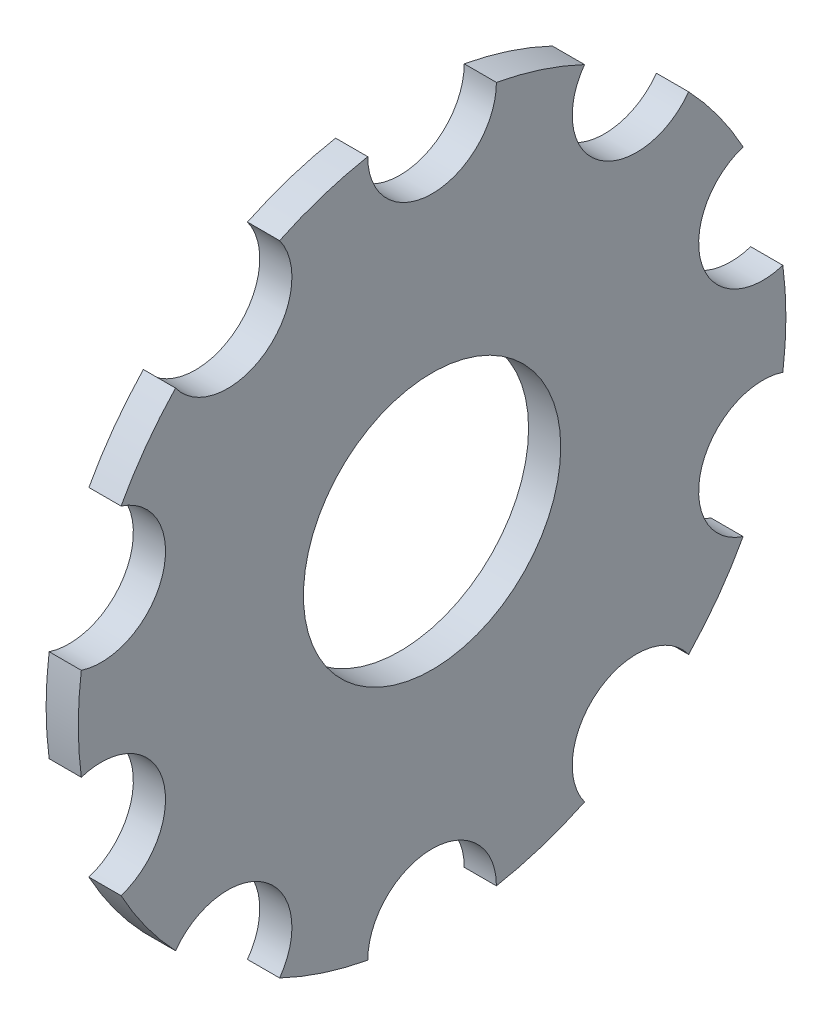
ISO-10303-21;
HEADER;
FILE_DESCRIPTION(('STEP AP214'),'2;1');
FILE_NAME('part.step','',(''),(''),'','','');
FILE_SCHEMA(('AUTOMOTIVE_DESIGN { 1 0 10303 214 1 1 1 1 }'));
ENDSEC;
DATA;
#1=APPLICATION_CONTEXT('core data for automotive mechanical design processes');
#2=APPLICATION_PROTOCOL_DEFINITION('international standard','automotive_design',2000,#1);
#3=PRODUCT_CONTEXT('',#1,'mechanical');
#4=PRODUCT('Part','Part','',(#3));
#5=PRODUCT_RELATED_PRODUCT_CATEGORY('part','',(#4));
#6=PRODUCT_DEFINITION_FORMATION('','',#4);
#7=PRODUCT_DEFINITION_CONTEXT('part definition',#1,'design');
#8=PRODUCT_DEFINITION('design','',#6,#7);
#9=PRODUCT_DEFINITION_SHAPE('','',#8);
#10=(LENGTH_UNIT() NAMED_UNIT(*) SI_UNIT(.MILLI.,.METRE.));
#11=(NAMED_UNIT(*) PLANE_ANGLE_UNIT() SI_UNIT($,.RADIAN.));
#12=(NAMED_UNIT(*) SI_UNIT($,.STERADIAN.) SOLID_ANGLE_UNIT());
#13=UNCERTAINTY_MEASURE_WITH_UNIT(LENGTH_MEASURE(1.E-05),#10,'distance_accuracy_value','');
#14=(GEOMETRIC_REPRESENTATION_CONTEXT(3) GLOBAL_UNCERTAINTY_ASSIGNED_CONTEXT((#13)) GLOBAL_UNIT_ASSIGNED_CONTEXT((#10,
#11,#12)) REPRESENTATION_CONTEXT('',''));
#15=CARTESIAN_POINT('',(0.,0.,0.));
#16=DIRECTION('',(0.,0.,1.));
#17=DIRECTION('',(1.,0.,0.));
#18=AXIS2_PLACEMENT_3D('',#15,#16,#17);
#19=CARTESIAN_POINT('',(5.,0.,0.));
#20=DIRECTION('',(1.,0.,0.));
#21=DIRECTION('',(0.,0.,-1.));
#22=AXIS2_PLACEMENT_3D('',#19,#20,#21);
#23=PLANE('',#22);
#24=CARTESIAN_POINT('',(5.,1.38777878078066E-13,1063.28607364013));
#25=DIRECTION('',(1.,0.,0.));
#26=DIRECTION('',(0.,0.,-1.));
#27=AXIS2_PLACEMENT_3D('',#24,#25,#26);
#28=CIRCLE('',#27,10.0000000000001);
#29=CARTESIAN_POINT('',(5.,1.38777878078066E-13,1053.28607364013));
#30=VERTEX_POINT('',#29);
#31=EDGE_CURVE('E36',#30,#30,#28,.T.);
#32=ORIENTED_EDGE('',*,*,#31,.T.);
#33=EDGE_LOOP('',(#32));
#34=FACE_BOUND('',#33,.T.);
#35=CARTESIAN_POINT('',(5.,21.8771419195574,1047.39139964436));
#36=DIRECTION('',(-1.,0.,0.));
#37=DIRECTION('',(0.,0.,-1.));
#38=AXIS2_PLACEMENT_3D('',#35,#36,#37);
#39=CIRCLE('',#38,4.99999999999995);
#40=CARTESIAN_POINT('',(5.,18.9382156580958,1043.34631467249));
#41=VERTEX_POINT('',#40);
#42=CARTESIAN_POINT('',(5.,24.8160681810197,1051.43648461624));
#43=VERTEX_POINT('',#42);
#44=EDGE_CURVE('E287',#41,#43,#39,.T.);
#45=ORIENTED_EDGE('',*,*,#44,.F.);
#46=CARTESIAN_POINT('',(5.,1.38777878078066E-13,1063.28607364013));
#47=DIRECTION('',(1.,0.,0.));
#48=DIRECTION('',(0.,0.,-1.));
#49=AXIS2_PLACEMENT_3D('',#46,#47,#48);
#50=CIRCLE('',#49,27.5000000000033);
#51=CARTESIAN_POINT('',(5.,13.1116072180443,1039.11303584675));
#52=VERTEX_POINT('',#51);
#53=EDGE_CURVE('E318',#52,#41,#50,.T.);
#54=ORIENTED_EDGE('',*,*,#53,.F.);
#55=CARTESIAN_POINT('',(5.,8.35632463656877,1037.56795087488));
#56=DIRECTION('',(-1.,0.,0.));
#57=DIRECTION('',(0.,0.,-1.));
#58=AXIS2_PLACEMENT_3D('',#55,#56,#57);
#59=CIRCLE('',#58,4.99999999999983);
#60=CARTESIAN_POINT('',(5.,3.60104205509325,1036.022865903));
#61=VERTEX_POINT('',#60);
#62=EDGE_CURVE('E316',#61,#52,#59,.T.);
#63=ORIENTED_EDGE('',*,*,#62,.F.);
#64=CARTESIAN_POINT('',(5.,1.38777878078066E-13,1063.28607364013));
#65=DIRECTION('',(1.,0.,0.));
#66=DIRECTION('',(0.,0.,-1.));
#67=AXIS2_PLACEMENT_3D('',#64,#65,#66);
#68=CIRCLE('',#67,27.5000000000039);
#69=CARTESIAN_POINT('',(5.,-3.60104205508557,1036.022865903));
#70=VERTEX_POINT('',#69);
#71=EDGE_CURVE('E314',#70,#61,#68,.T.);
#72=ORIENTED_EDGE('',*,*,#71,.F.);
#73=CARTESIAN_POINT('',(5.,-8.35632463656122,1037.56795087487));
#74=DIRECTION('',(-1.,0.,0.));
#75=DIRECTION('',(0.,0.,-1.));
#76=AXIS2_PLACEMENT_3D('',#73,#74,#75);
#77=CIRCLE('',#76,4.99999999999983);
#78=CARTESIAN_POINT('',(5.,-13.111607218037,1039.11303584675));
#79=VERTEX_POINT('',#78);
#80=EDGE_CURVE('E312',#79,#70,#77,.T.);
#81=ORIENTED_EDGE('',*,*,#80,.F.);
#82=CARTESIAN_POINT('',(5.,1.38777878078066E-13,1063.28607364013));
#83=DIRECTION('',(1.,0.,0.));
#84=DIRECTION('',(0.,0.,-1.));
#85=AXIS2_PLACEMENT_3D('',#82,#83,#84);
#86=CIRCLE('',#85,27.5000000000033);
#87=CARTESIAN_POINT('',(5.,-18.9382156580902,1043.34631467248));
#88=VERTEX_POINT('',#87);
#89=EDGE_CURVE('E310',#88,#79,#86,.T.);
#90=ORIENTED_EDGE('',*,*,#89,.F.);
#91=CARTESIAN_POINT('',(5.,-21.8771419195526,1047.39139964435));
#92=DIRECTION('',(-1.,0.,0.));
#93=DIRECTION('',(0.,0.,-1.));
#94=AXIS2_PLACEMENT_3D('',#91,#92,#93);
#95=CIRCLE('',#94,4.99999999999983);
#96=CARTESIAN_POINT('',(5.,-24.8160681810149,1051.43648461623));
#97=VERTEX_POINT('',#96);
#98=EDGE_CURVE('E308',#97,#88,#95,.T.);
#99=ORIENTED_EDGE('',*,*,#98,.F.);
#100=CARTESIAN_POINT('',(5.,1.38777878078066E-13,1063.28607364013));
#101=DIRECTION('',(1.,0.,0.));
#102=DIRECTION('',(0.,0.,-1.));
#103=AXIS2_PLACEMENT_3D('',#100,#101,#102);
#104=CIRCLE('',#103,27.5000000000013);
#105=CARTESIAN_POINT('',(5.,-27.0416345659798,1058.28607364012));
#106=VERTEX_POINT('',#105);
#107=EDGE_CURVE('E306',#106,#97,#104,.T.);
#108=ORIENTED_EDGE('',*,*,#107,.F.);
#109=CARTESIAN_POINT('',(5.,-27.0416345659798,1063.28607364012));
#110=DIRECTION('',(-1.,0.,0.));
#111=DIRECTION('',(0.,0.,-1.));
#112=AXIS2_PLACEMENT_3D('',#109,#110,#111);
#113=CIRCLE('',#112,4.99999999999989);
#114=CARTESIAN_POINT('',(5.,-27.0416345659798,1068.28607364012));
#115=VERTEX_POINT('',#114);
#116=EDGE_CURVE('E304',#115,#106,#113,.T.);
#117=ORIENTED_EDGE('',*,*,#116,.F.);
#118=CARTESIAN_POINT('',(5.,1.38777878078066E-13,1063.28607364013));
#119=DIRECTION('',(1.,0.,0.));
#120=DIRECTION('',(0.,0.,-1.));
#121=AXIS2_PLACEMENT_3D('',#118,#119,#120);
#122=CIRCLE('',#121,27.4999999999986);
#123=CARTESIAN_POINT('',(5.,-24.816068181019,1075.13566266401));
#124=VERTEX_POINT('',#123);
#125=EDGE_CURVE('E302',#124,#115,#122,.T.);
#126=ORIENTED_EDGE('',*,*,#125,.F.);
#127=CARTESIAN_POINT('',(5.,-21.8771419195567,1079.18074763588));
#128=DIRECTION('',(-1.,0.,0.));
#129=DIRECTION('',(0.,0.,-1.));
#130=AXIS2_PLACEMENT_3D('',#127,#128,#129);
#131=CIRCLE('',#130,4.99999999999995);
#132=CARTESIAN_POINT('',(5.,-18.9382156580947,1083.22583260776));
#133=VERTEX_POINT('',#132);
#134=EDGE_CURVE('E300',#133,#124,#131,.T.);
#135=ORIENTED_EDGE('',*,*,#134,.F.);
#136=CARTESIAN_POINT('',(5.,1.38777878078066E-13,1063.28607364013));
#137=DIRECTION('',(1.,0.,0.));
#138=DIRECTION('',(0.,0.,-1.));
#139=AXIS2_PLACEMENT_3D('',#136,#137,#138);
#140=CIRCLE('',#139,27.4999999999967);
#141=CARTESIAN_POINT('',(5.,-13.1116072180438,1087.45911143349));
#142=VERTEX_POINT('',#141);
#143=EDGE_CURVE('E298',#142,#133,#140,.T.);
#144=ORIENTED_EDGE('',*,*,#143,.F.);
#145=CARTESIAN_POINT('',(5.,-8.3563246365681,1089.00419640537));
#146=DIRECTION('',(-1.,0.,0.));
#147=DIRECTION('',(0.,0.,-1.));
#148=AXIS2_PLACEMENT_3D('',#145,#146,#147);
#149=CIRCLE('',#148,4.99999999999983);
#150=CARTESIAN_POINT('',(5.,-3.60104205509259,1090.54928137724));
#151=VERTEX_POINT('',#150);
#152=EDGE_CURVE('E296',#151,#142,#149,.T.);
#153=ORIENTED_EDGE('',*,*,#152,.F.);
#154=CARTESIAN_POINT('',(5.,1.38777878078066E-13,1063.28607364013));
#155=DIRECTION('',(1.,0.,0.));
#156=DIRECTION('',(0.,0.,-1.));
#157=AXIS2_PLACEMENT_3D('',#154,#155,#156);
#158=CIRCLE('',#157,27.4999999999962);
#159=CARTESIAN_POINT('',(5.,3.6010420550861,1090.54928137725));
#160=VERTEX_POINT('',#159);
#161=EDGE_CURVE('E294',#160,#151,#158,.T.);
#162=ORIENTED_EDGE('',*,*,#161,.F.);
#163=CARTESIAN_POINT('',(5.,8.35632463656166,1089.00419640537));
#164=DIRECTION('',(-1.,0.,0.));
#165=DIRECTION('',(0.,0.,-1.));
#166=AXIS2_PLACEMENT_3D('',#163,#164,#165);
#167=CIRCLE('',#166,4.99999999999982);
#168=CARTESIAN_POINT('',(5.,13.1116072180376,1087.4591114335));
#169=VERTEX_POINT('',#168);
#170=EDGE_CURVE('E292',#169,#160,#167,.T.);
#171=ORIENTED_EDGE('',*,*,#170,.F.);
#172=CARTESIAN_POINT('',(5.,1.38777878078066E-13,1063.28607364013));
#173=DIRECTION('',(1.,0.,0.));
#174=DIRECTION('',(0.,0.,-1.));
#175=AXIS2_PLACEMENT_3D('',#172,#173,#174);
#176=CIRCLE('',#175,27.4999999999968);
#177=CARTESIAN_POINT('',(5.,18.9382156580906,1083.22583260777));
#178=VERTEX_POINT('',#177);
#179=EDGE_CURVE('E189',#178,#169,#176,.T.);
#180=ORIENTED_EDGE('',*,*,#179,.F.);
#181=CARTESIAN_POINT('',(5.,21.8771419195528,1079.18074763589));
#182=DIRECTION('',(-1.,0.,0.));
#183=DIRECTION('',(0.,0.,-1.));
#184=AXIS2_PLACEMENT_3D('',#181,#182,#183);
#185=CIRCLE('',#184,4.99999999999992);
#186=CARTESIAN_POINT('',(5.,24.8160681810163,1075.13566266402));
#187=VERTEX_POINT('',#186);
#188=EDGE_CURVE('E185',#187,#178,#185,.T.);
#189=ORIENTED_EDGE('',*,*,#188,.F.);
#190=CARTESIAN_POINT('',(5.,1.38777878078066E-13,1063.28607364013));
#191=DIRECTION('',(1.,0.,0.));
#192=DIRECTION('',(0.,0.,-1.));
#193=AXIS2_PLACEMENT_3D('',#190,#191,#192);
#194=CIRCLE('',#193,27.4999999999988);
#195=CARTESIAN_POINT('',(5.,27.0416345659801,1068.28607364013));
#196=VERTEX_POINT('',#195);
#197=EDGE_CURVE('E176',#196,#187,#194,.T.);
#198=ORIENTED_EDGE('',*,*,#197,.F.);
#199=CARTESIAN_POINT('',(5.,27.0416345659801,1063.28607364013));
#200=DIRECTION('',(-1.,0.,0.));
#201=DIRECTION('',(0.,0.,-1.));
#202=AXIS2_PLACEMENT_3D('',#199,#200,#201);
#203=CIRCLE('',#202,4.99999999999989);
#204=CARTESIAN_POINT('',(5.,27.0416345659801,1058.28607364013));
#205=VERTEX_POINT('',#204);
#206=EDGE_CURVE('E184',#205,#196,#203,.T.);
#207=ORIENTED_EDGE('',*,*,#206,.F.);
#208=CARTESIAN_POINT('',(5.,1.38777878078066E-13,1063.28607364013));
#209=DIRECTION('',(1.,0.,0.));
#210=DIRECTION('',(0.,0.,-1.));
#211=AXIS2_PLACEMENT_3D('',#208,#209,#210);
#212=CIRCLE('',#211,27.5000000000013);
#213=EDGE_CURVE('E42',#43,#205,#212,.T.);
#214=ORIENTED_EDGE('',*,*,#213,.F.);
#215=EDGE_LOOP('',(#45,#54,#63,#72,#81,#90,#99,#108,#117,#126,#135,#144,#153,#162,#171,#180,
#189,#198,#207,#214));
#216=FACE_BOUND('',#215,.T.);
#217=ADVANCED_FACE('F32',(#34,#216),#23,.F.);
#218=CARTESIAN_POINT('',(7.5,27.0416345659801,1063.28607364013));
#219=DIRECTION('',(-1.,0.,0.));
#220=DIRECTION('',(0.,0.,1.));
#221=AXIS2_PLACEMENT_3D('',#218,#219,#220);
#222=CYLINDRICAL_SURFACE('',#221,4.99999999999989);
#223=ORIENTED_EDGE('',*,*,#206,.T.);
#224=DIRECTION('',(-1.,0.,0.));
#225=VECTOR('',#224,1.);
#226=CARTESIAN_POINT('',(7.5,27.0416345659801,1068.28607364013));
#227=LINE('',#226,#225);
#228=CARTESIAN_POINT('',(7.5,27.0416345659801,1068.28607364013));
#229=VERTEX_POINT('',#228);
#230=EDGE_CURVE('E183',#229,#196,#227,.T.);
#231=ORIENTED_EDGE('',*,*,#230,.F.);
#232=CARTESIAN_POINT('',(7.5,27.0416345659801,1063.28607364013));
#233=DIRECTION('',(-1.,0.,0.));
#234=DIRECTION('',(0.,0.,-1.));
#235=AXIS2_PLACEMENT_3D('',#232,#233,#234);
#236=CIRCLE('',#235,4.99999999999989);
#237=CARTESIAN_POINT('',(7.5,27.0416345659801,1058.28607364013));
#238=VERTEX_POINT('',#237);
#239=EDGE_CURVE('E116',#238,#229,#236,.T.);
#240=ORIENTED_EDGE('',*,*,#239,.F.);
#241=DIRECTION('',(-1.,0.,0.));
#242=VECTOR('',#241,1.);
#243=CARTESIAN_POINT('',(7.5,27.0416345659801,1058.28607364013));
#244=LINE('',#243,#242);
#245=EDGE_CURVE('E200',#238,#205,#244,.T.);
#246=ORIENTED_EDGE('',*,*,#245,.T.);
#247=EDGE_LOOP('',(#223,#231,#240,#246));
#248=FACE_BOUND('',#247,.T.);
#249=ADVANCED_FACE('F409',(#248),#222,.F.);
#250=CARTESIAN_POINT('',(7.5,1.38777878078066E-13,1063.28607364013));
#251=DIRECTION('',(-1.,0.,0.));
#252=DIRECTION('',(0.,0.,1.));
#253=AXIS2_PLACEMENT_3D('',#250,#251,#252);
#254=CYLINDRICAL_SURFACE('',#253,27.4999999999988);
#255=ORIENTED_EDGE('',*,*,#197,.T.);
#256=DIRECTION('',(-1.,0.,0.));
#257=VECTOR('',#256,1.);
#258=CARTESIAN_POINT('',(7.5,24.8160681810163,1075.13566266402));
#259=LINE('',#258,#257);
#260=CARTESIAN_POINT('',(7.5,24.8160681810163,1075.13566266402));
#261=VERTEX_POINT('',#260);
#262=EDGE_CURVE('E181',#261,#187,#259,.T.);
#263=ORIENTED_EDGE('',*,*,#262,.F.);
#264=CARTESIAN_POINT('',(7.5,1.38777878078066E-13,1063.28607364013));
#265=DIRECTION('',(1.,0.,0.));
#266=DIRECTION('',(0.,0.,-1.));
#267=AXIS2_PLACEMENT_3D('',#264,#265,#266);
#268=CIRCLE('',#267,27.4999999999988);
#269=EDGE_CURVE('E283',#229,#261,#268,.T.);
#270=ORIENTED_EDGE('',*,*,#269,.F.);
#271=ORIENTED_EDGE('',*,*,#230,.T.);
#272=EDGE_LOOP('',(#255,#263,#270,#271));
#273=FACE_BOUND('',#272,.T.);
#274=ADVANCED_FACE('F178',(#273),#254,.T.);
#275=CARTESIAN_POINT('',(7.5,21.8771419195528,1079.18074763589));
#276=DIRECTION('',(-1.,0.,0.));
#277=DIRECTION('',(0.,0.,1.));
#278=AXIS2_PLACEMENT_3D('',#275,#276,#277);
#279=CYLINDRICAL_SURFACE('',#278,4.99999999999992);
#280=ORIENTED_EDGE('',*,*,#188,.T.);
#281=DIRECTION('',(-1.,0.,0.));
#282=VECTOR('',#281,1.);
#283=CARTESIAN_POINT('',(7.5,18.9382156580906,1083.22583260777));
#284=LINE('',#283,#282);
#285=CARTESIAN_POINT('',(7.5,18.9382156580906,1083.22583260777));
#286=VERTEX_POINT('',#285);
#287=EDGE_CURVE('E196',#286,#178,#284,.T.);
#288=ORIENTED_EDGE('',*,*,#287,.F.);
#289=CARTESIAN_POINT('',(7.5,21.8771419195528,1079.18074763589));
#290=DIRECTION('',(-1.,0.,0.));
#291=DIRECTION('',(0.,0.,-1.));
#292=AXIS2_PLACEMENT_3D('',#289,#290,#291);
#293=CIRCLE('',#292,4.99999999999992);
#294=EDGE_CURVE('E195',#261,#286,#293,.T.);
#295=ORIENTED_EDGE('',*,*,#294,.F.);
#296=ORIENTED_EDGE('',*,*,#262,.T.);
#297=EDGE_LOOP('',(#280,#288,#295,#296));
#298=FACE_BOUND('',#297,.T.);
#299=ADVANCED_FACE('F194',(#298),#279,.F.);
#300=CARTESIAN_POINT('',(7.5,1.38777878078066E-13,1063.28607364013));
#301=DIRECTION('',(-1.,0.,0.));
#302=DIRECTION('',(0.,0.,1.));
#303=AXIS2_PLACEMENT_3D('',#300,#301,#302);
#304=CYLINDRICAL_SURFACE('',#303,27.4999999999968);
#305=ORIENTED_EDGE('',*,*,#179,.T.);
#306=DIRECTION('',(-1.,0.,0.));
#307=VECTOR('',#306,1.);
#308=CARTESIAN_POINT('',(7.5,13.1116072180376,1087.4591114335));
#309=LINE('',#308,#307);
#310=CARTESIAN_POINT('',(7.5,13.1116072180376,1087.4591114335));
#311=VERTEX_POINT('',#310);
#312=EDGE_CURVE('E198',#311,#169,#309,.T.);
#313=ORIENTED_EDGE('',*,*,#312,.F.);
#314=CARTESIAN_POINT('',(7.5,1.38777878078066E-13,1063.28607364013));
#315=DIRECTION('',(1.,0.,0.));
#316=DIRECTION('',(0.,0.,-1.));
#317=AXIS2_PLACEMENT_3D('',#314,#315,#316);
#318=CIRCLE('',#317,27.4999999999968);
#319=EDGE_CURVE('E280',#286,#311,#318,.T.);
#320=ORIENTED_EDGE('',*,*,#319,.F.);
#321=ORIENTED_EDGE('',*,*,#287,.T.);
#322=EDGE_LOOP('',(#305,#313,#320,#321));
#323=FACE_BOUND('',#322,.T.);
#324=ADVANCED_FACE('F399',(#323),#304,.T.);
#325=CARTESIAN_POINT('',(7.5,8.35632463656166,1089.00419640537));
#326=DIRECTION('',(-1.,0.,0.));
#327=DIRECTION('',(0.,0.,1.));
#328=AXIS2_PLACEMENT_3D('',#325,#326,#327);
#329=CYLINDRICAL_SURFACE('',#328,4.99999999999982);
#330=ORIENTED_EDGE('',*,*,#170,.T.);
#331=DIRECTION('',(-1.,0.,0.));
#332=VECTOR('',#331,1.);
#333=CARTESIAN_POINT('',(7.5,3.6010420550861,1090.54928137725));
#334=LINE('',#333,#332);
#335=CARTESIAN_POINT('',(7.5,3.6010420550861,1090.54928137725));
#336=VERTEX_POINT('',#335);
#337=EDGE_CURVE('E206',#336,#160,#334,.T.);
#338=ORIENTED_EDGE('',*,*,#337,.F.);
#339=CARTESIAN_POINT('',(7.5,8.35632463656166,1089.00419640537));
#340=DIRECTION('',(-1.,0.,0.));
#341=DIRECTION('',(0.,0.,-1.));
#342=AXIS2_PLACEMENT_3D('',#339,#340,#341);
#343=CIRCLE('',#342,4.99999999999982);
#344=EDGE_CURVE('E278',#311,#336,#343,.T.);
#345=ORIENTED_EDGE('',*,*,#344,.F.);
#346=ORIENTED_EDGE('',*,*,#312,.T.);
#347=EDGE_LOOP('',(#330,#338,#345,#346));
#348=FACE_BOUND('',#347,.T.);
#349=ADVANCED_FACE('F396',(#348),#329,.F.);
#350=CARTESIAN_POINT('',(7.5,1.38777878078066E-13,1063.28607364013));
#351=DIRECTION('',(-1.,0.,0.));
#352=DIRECTION('',(0.,0.,1.));
#353=AXIS2_PLACEMENT_3D('',#350,#351,#352);
#354=CYLINDRICAL_SURFACE('',#353,27.4999999999962);
#355=ORIENTED_EDGE('',*,*,#161,.T.);
#356=DIRECTION('',(-1.,0.,0.));
#357=VECTOR('',#356,1.);
#358=CARTESIAN_POINT('',(7.5,-3.60104205509259,1090.54928137724));
#359=LINE('',#358,#357);
#360=CARTESIAN_POINT('',(7.5,-3.60104205509259,1090.54928137724));
#361=VERTEX_POINT('',#360);
#362=EDGE_CURVE('E209',#361,#151,#359,.T.);
#363=ORIENTED_EDGE('',*,*,#362,.F.);
#364=CARTESIAN_POINT('',(7.5,1.38777878078066E-13,1063.28607364013));
#365=DIRECTION('',(1.,0.,0.));
#366=DIRECTION('',(0.,0.,-1.));
#367=AXIS2_PLACEMENT_3D('',#364,#365,#366);
#368=CIRCLE('',#367,27.4999999999962);
#369=EDGE_CURVE('E276',#336,#361,#368,.T.);
#370=ORIENTED_EDGE('',*,*,#369,.F.);
#371=ORIENTED_EDGE('',*,*,#337,.T.);
#372=EDGE_LOOP('',(#355,#363,#370,#371));
#373=FACE_BOUND('',#372,.T.);
#374=ADVANCED_FACE('F391',(#373),#354,.T.);
#375=CARTESIAN_POINT('',(7.5,-8.3563246365681,1089.00419640537));
#376=DIRECTION('',(-1.,0.,0.));
#377=DIRECTION('',(0.,0.,1.));
#378=AXIS2_PLACEMENT_3D('',#375,#376,#377);
#379=CYLINDRICAL_SURFACE('',#378,4.99999999999983);
#380=ORIENTED_EDGE('',*,*,#152,.T.);
#381=DIRECTION('',(-1.,0.,0.));
#382=VECTOR('',#381,1.);
#383=CARTESIAN_POINT('',(7.5,-13.1116072180438,1087.45911143349));
#384=LINE('',#383,#382);
#385=CARTESIAN_POINT('',(7.5,-13.1116072180438,1087.45911143349));
#386=VERTEX_POINT('',#385);
#387=EDGE_CURVE('E212',#386,#142,#384,.T.);
#388=ORIENTED_EDGE('',*,*,#387,.F.);
#389=CARTESIAN_POINT('',(7.5,-8.3563246365681,1089.00419640537));
#390=DIRECTION('',(-1.,0.,0.));
#391=DIRECTION('',(0.,0.,-1.));
#392=AXIS2_PLACEMENT_3D('',#389,#390,#391);
#393=CIRCLE('',#392,4.99999999999983);
#394=EDGE_CURVE('E274',#361,#386,#393,.T.);
#395=ORIENTED_EDGE('',*,*,#394,.F.);
#396=ORIENTED_EDGE('',*,*,#362,.T.);
#397=EDGE_LOOP('',(#380,#388,#395,#396));
#398=FACE_BOUND('',#397,.T.);
#399=ADVANCED_FACE('F387',(#398),#379,.F.);
#400=CARTESIAN_POINT('',(7.5,1.38777878078066E-13,1063.28607364013));
#401=DIRECTION('',(-1.,0.,0.));
#402=DIRECTION('',(0.,0.,1.));
#403=AXIS2_PLACEMENT_3D('',#400,#401,#402);
#404=CYLINDRICAL_SURFACE('',#403,27.4999999999967);
#405=ORIENTED_EDGE('',*,*,#143,.T.);
#406=DIRECTION('',(-1.,0.,0.));
#407=VECTOR('',#406,1.);
#408=CARTESIAN_POINT('',(7.5,-18.9382156580947,1083.22583260776));
#409=LINE('',#408,#407);
#410=CARTESIAN_POINT('',(7.5,-18.9382156580947,1083.22583260776));
#411=VERTEX_POINT('',#410);
#412=EDGE_CURVE('E215',#411,#133,#409,.T.);
#413=ORIENTED_EDGE('',*,*,#412,.F.);
#414=CARTESIAN_POINT('',(7.5,1.38777878078066E-13,1063.28607364013));
#415=DIRECTION('',(1.,0.,0.));
#416=DIRECTION('',(0.,0.,-1.));
#417=AXIS2_PLACEMENT_3D('',#414,#415,#416);
#418=CIRCLE('',#417,27.4999999999967);
#419=EDGE_CURVE('E272',#386,#411,#418,.T.);
#420=ORIENTED_EDGE('',*,*,#419,.F.);
#421=ORIENTED_EDGE('',*,*,#387,.T.);
#422=EDGE_LOOP('',(#405,#413,#420,#421));
#423=FACE_BOUND('',#422,.T.);
#424=ADVANCED_FACE('F384',(#423),#404,.T.);
#425=CARTESIAN_POINT('',(7.5,-21.8771419195567,1079.18074763588));
#426=DIRECTION('',(-1.,0.,0.));
#427=DIRECTION('',(0.,0.,1.));
#428=AXIS2_PLACEMENT_3D('',#425,#426,#427);
#429=CYLINDRICAL_SURFACE('',#428,4.99999999999995);
#430=ORIENTED_EDGE('',*,*,#134,.T.);
#431=DIRECTION('',(-1.,0.,0.));
#432=VECTOR('',#431,1.);
#433=CARTESIAN_POINT('',(7.5,-24.816068181019,1075.13566266401));
#434=LINE('',#433,#432);
#435=CARTESIAN_POINT('',(7.5,-24.816068181019,1075.13566266401));
#436=VERTEX_POINT('',#435);
#437=EDGE_CURVE('E218',#436,#124,#434,.T.);
#438=ORIENTED_EDGE('',*,*,#437,.F.);
#439=CARTESIAN_POINT('',(7.5,-21.8771419195567,1079.18074763588));
#440=DIRECTION('',(-1.,0.,0.));
#441=DIRECTION('',(0.,0.,-1.));
#442=AXIS2_PLACEMENT_3D('',#439,#440,#441);
#443=CIRCLE('',#442,4.99999999999995);
#444=EDGE_CURVE('E270',#411,#436,#443,.T.);
#445=ORIENTED_EDGE('',*,*,#444,.F.);
#446=ORIENTED_EDGE('',*,*,#412,.T.);
#447=EDGE_LOOP('',(#430,#438,#445,#446));
#448=FACE_BOUND('',#447,.T.);
#449=ADVANCED_FACE('F376',(#448),#429,.F.);
#450=CARTESIAN_POINT('',(7.5,1.38777878078066E-13,1063.28607364013));
#451=DIRECTION('',(-1.,0.,0.));
#452=DIRECTION('',(0.,0.,1.));
#453=AXIS2_PLACEMENT_3D('',#450,#451,#452);
#454=CYLINDRICAL_SURFACE('',#453,27.4999999999986);
#455=ORIENTED_EDGE('',*,*,#125,.T.);
#456=DIRECTION('',(-1.,0.,0.));
#457=VECTOR('',#456,1.);
#458=CARTESIAN_POINT('',(7.5,-27.0416345659798,1068.28607364012));
#459=LINE('',#458,#457);
#460=CARTESIAN_POINT('',(7.5,-27.0416345659798,1068.28607364012));
#461=VERTEX_POINT('',#460);
#462=EDGE_CURVE('E221',#461,#115,#459,.T.);
#463=ORIENTED_EDGE('',*,*,#462,.F.);
#464=CARTESIAN_POINT('',(7.5,1.38777878078066E-13,1063.28607364013));
#465=DIRECTION('',(1.,0.,0.));
#466=DIRECTION('',(0.,0.,-1.));
#467=AXIS2_PLACEMENT_3D('',#464,#465,#466);
#468=CIRCLE('',#467,27.4999999999986);
#469=EDGE_CURVE('E268',#436,#461,#468,.T.);
#470=ORIENTED_EDGE('',*,*,#469,.F.);
#471=ORIENTED_EDGE('',*,*,#437,.T.);
#472=EDGE_LOOP('',(#455,#463,#470,#471));
#473=FACE_BOUND('',#472,.T.);
#474=ADVANCED_FACE('F372',(#473),#454,.T.);
#475=CARTESIAN_POINT('',(7.5,-27.0416345659798,1063.28607364012));
#476=DIRECTION('',(-1.,0.,0.));
#477=DIRECTION('',(0.,0.,1.));
#478=AXIS2_PLACEMENT_3D('',#475,#476,#477);
#479=CYLINDRICAL_SURFACE('',#478,4.99999999999989);
#480=ORIENTED_EDGE('',*,*,#116,.T.);
#481=DIRECTION('',(-1.,0.,0.));
#482=VECTOR('',#481,1.);
#483=CARTESIAN_POINT('',(7.5,-27.0416345659798,1058.28607364012));
#484=LINE('',#483,#482);
#485=CARTESIAN_POINT('',(7.5,-27.0416345659798,1058.28607364012));
#486=VERTEX_POINT('',#485);
#487=EDGE_CURVE('E224',#486,#106,#484,.T.);
#488=ORIENTED_EDGE('',*,*,#487,.F.);
#489=CARTESIAN_POINT('',(7.5,-27.0416345659798,1063.28607364012));
#490=DIRECTION('',(-1.,0.,0.));
#491=DIRECTION('',(0.,0.,-1.));
#492=AXIS2_PLACEMENT_3D('',#489,#490,#491);
#493=CIRCLE('',#492,4.99999999999989);
#494=EDGE_CURVE('E266',#461,#486,#493,.T.);
#495=ORIENTED_EDGE('',*,*,#494,.F.);
#496=ORIENTED_EDGE('',*,*,#462,.T.);
#497=EDGE_LOOP('',(#480,#488,#495,#496));
#498=FACE_BOUND('',#497,.T.);
#499=ADVANCED_FACE('F369',(#498),#479,.F.);
#500=CARTESIAN_POINT('',(7.5,1.38777878078066E-13,1063.28607364013));
#501=DIRECTION('',(-1.,0.,0.));
#502=DIRECTION('',(0.,0.,1.));
#503=AXIS2_PLACEMENT_3D('',#500,#501,#502);
#504=CYLINDRICAL_SURFACE('',#503,27.5000000000013);
#505=ORIENTED_EDGE('',*,*,#107,.T.);
#506=DIRECTION('',(-1.,0.,0.));
#507=VECTOR('',#506,1.);
#508=CARTESIAN_POINT('',(7.5,-24.8160681810149,1051.43648461623));
#509=LINE('',#508,#507);
#510=CARTESIAN_POINT('',(7.5,-24.8160681810149,1051.43648461623));
#511=VERTEX_POINT('',#510);
#512=EDGE_CURVE('E227',#511,#97,#509,.T.);
#513=ORIENTED_EDGE('',*,*,#512,.F.);
#514=CARTESIAN_POINT('',(7.5,1.38777878078066E-13,1063.28607364013));
#515=DIRECTION('',(1.,0.,0.));
#516=DIRECTION('',(0.,0.,-1.));
#517=AXIS2_PLACEMENT_3D('',#514,#515,#516);
#518=CIRCLE('',#517,27.5000000000013);
#519=EDGE_CURVE('E264',#486,#511,#518,.T.);
#520=ORIENTED_EDGE('',*,*,#519,.F.);
#521=ORIENTED_EDGE('',*,*,#487,.T.);
#522=EDGE_LOOP('',(#505,#513,#520,#521));
#523=FACE_BOUND('',#522,.T.);
#524=ADVANCED_FACE('F361',(#523),#504,.T.);
#525=CARTESIAN_POINT('',(7.5,-21.8771419195526,1047.39139964435));
#526=DIRECTION('',(-1.,0.,0.));
#527=DIRECTION('',(0.,0.,1.));
#528=AXIS2_PLACEMENT_3D('',#525,#526,#527);
#529=CYLINDRICAL_SURFACE('',#528,4.99999999999983);
#530=ORIENTED_EDGE('',*,*,#98,.T.);
#531=DIRECTION('',(-1.,0.,0.));
#532=VECTOR('',#531,1.);
#533=CARTESIAN_POINT('',(7.5,-18.9382156580902,1043.34631467248));
#534=LINE('',#533,#532);
#535=CARTESIAN_POINT('',(7.5,-18.9382156580902,1043.34631467248));
#536=VERTEX_POINT('',#535);
#537=EDGE_CURVE('E230',#536,#88,#534,.T.);
#538=ORIENTED_EDGE('',*,*,#537,.F.);
#539=CARTESIAN_POINT('',(7.5,-21.8771419195526,1047.39139964435));
#540=DIRECTION('',(-1.,0.,0.));
#541=DIRECTION('',(0.,0.,-1.));
#542=AXIS2_PLACEMENT_3D('',#539,#540,#541);
#543=CIRCLE('',#542,4.99999999999983);
#544=EDGE_CURVE('E262',#511,#536,#543,.T.);
#545=ORIENTED_EDGE('',*,*,#544,.F.);
#546=ORIENTED_EDGE('',*,*,#512,.T.);
#547=EDGE_LOOP('',(#530,#538,#545,#546));
#548=FACE_BOUND('',#547,.T.);
#549=ADVANCED_FACE('F357',(#548),#529,.F.);
#550=CARTESIAN_POINT('',(7.5,1.38777878078066E-13,1063.28607364013));
#551=DIRECTION('',(-1.,0.,0.));
#552=DIRECTION('',(0.,0.,1.));
#553=AXIS2_PLACEMENT_3D('',#550,#551,#552);
#554=CYLINDRICAL_SURFACE('',#553,27.5000000000033);
#555=ORIENTED_EDGE('',*,*,#89,.T.);
#556=DIRECTION('',(-1.,0.,0.));
#557=VECTOR('',#556,1.);
#558=CARTESIAN_POINT('',(7.5,-13.111607218037,1039.11303584675));
#559=LINE('',#558,#557);
#560=CARTESIAN_POINT('',(7.5,-13.111607218037,1039.11303584675));
#561=VERTEX_POINT('',#560);
#562=EDGE_CURVE('E233',#561,#79,#559,.T.);
#563=ORIENTED_EDGE('',*,*,#562,.F.);
#564=CARTESIAN_POINT('',(7.5,1.38777878078066E-13,1063.28607364013));
#565=DIRECTION('',(1.,0.,0.));
#566=DIRECTION('',(0.,0.,-1.));
#567=AXIS2_PLACEMENT_3D('',#564,#565,#566);
#568=CIRCLE('',#567,27.5000000000033);
#569=EDGE_CURVE('E260',#536,#561,#568,.T.);
#570=ORIENTED_EDGE('',*,*,#569,.F.);
#571=ORIENTED_EDGE('',*,*,#537,.T.);
#572=EDGE_LOOP('',(#555,#563,#570,#571));
#573=FACE_BOUND('',#572,.T.);
#574=ADVANCED_FACE('F354',(#573),#554,.T.);
#575=CARTESIAN_POINT('',(7.5,-8.35632463656122,1037.56795087487));
#576=DIRECTION('',(-1.,0.,0.));
#577=DIRECTION('',(0.,0.,1.));
#578=AXIS2_PLACEMENT_3D('',#575,#576,#577);
#579=CYLINDRICAL_SURFACE('',#578,4.99999999999983);
#580=ORIENTED_EDGE('',*,*,#80,.T.);
#581=DIRECTION('',(-1.,0.,0.));
#582=VECTOR('',#581,1.);
#583=CARTESIAN_POINT('',(7.5,-3.60104205508557,1036.022865903));
#584=LINE('',#583,#582);
#585=CARTESIAN_POINT('',(7.5,-3.60104205508557,1036.022865903));
#586=VERTEX_POINT('',#585);
#587=EDGE_CURVE('E236',#586,#70,#584,.T.);
#588=ORIENTED_EDGE('',*,*,#587,.F.);
#589=CARTESIAN_POINT('',(7.5,-8.35632463656122,1037.56795087487));
#590=DIRECTION('',(-1.,0.,0.));
#591=DIRECTION('',(0.,0.,-1.));
#592=AXIS2_PLACEMENT_3D('',#589,#590,#591);
#593=CIRCLE('',#592,4.99999999999983);
#594=EDGE_CURVE('E258',#561,#586,#593,.T.);
#595=ORIENTED_EDGE('',*,*,#594,.F.);
#596=ORIENTED_EDGE('',*,*,#562,.T.);
#597=EDGE_LOOP('',(#580,#588,#595,#596));
#598=FACE_BOUND('',#597,.T.);
#599=ADVANCED_FACE('F346',(#598),#579,.F.);
#600=CARTESIAN_POINT('',(7.5,1.38777878078066E-13,1063.28607364013));
#601=DIRECTION('',(-1.,0.,0.));
#602=DIRECTION('',(0.,0.,1.));
#603=AXIS2_PLACEMENT_3D('',#600,#601,#602);
#604=CYLINDRICAL_SURFACE('',#603,27.5000000000039);
#605=ORIENTED_EDGE('',*,*,#71,.T.);
#606=DIRECTION('',(-1.,0.,0.));
#607=VECTOR('',#606,1.);
#608=CARTESIAN_POINT('',(7.5,3.60104205509325,1036.022865903));
#609=LINE('',#608,#607);
#610=CARTESIAN_POINT('',(7.5,3.60104205509325,1036.022865903));
#611=VERTEX_POINT('',#610);
#612=EDGE_CURVE('E239',#611,#61,#609,.T.);
#613=ORIENTED_EDGE('',*,*,#612,.F.);
#614=CARTESIAN_POINT('',(7.5,1.38777878078066E-13,1063.28607364013));
#615=DIRECTION('',(1.,0.,0.));
#616=DIRECTION('',(0.,0.,-1.));
#617=AXIS2_PLACEMENT_3D('',#614,#615,#616);
#618=CIRCLE('',#617,27.5000000000039);
#619=EDGE_CURVE('E256',#586,#611,#618,.T.);
#620=ORIENTED_EDGE('',*,*,#619,.F.);
#621=ORIENTED_EDGE('',*,*,#587,.T.);
#622=EDGE_LOOP('',(#605,#613,#620,#621));
#623=FACE_BOUND('',#622,.T.);
#624=ADVANCED_FACE('F342',(#623),#604,.T.);
#625=CARTESIAN_POINT('',(7.5,8.35632463656877,1037.56795087488));
#626=DIRECTION('',(-1.,0.,0.));
#627=DIRECTION('',(0.,0.,1.));
#628=AXIS2_PLACEMENT_3D('',#625,#626,#627);
#629=CYLINDRICAL_SURFACE('',#628,4.99999999999983);
#630=ORIENTED_EDGE('',*,*,#62,.T.);
#631=DIRECTION('',(-1.,0.,0.));
#632=VECTOR('',#631,1.);
#633=CARTESIAN_POINT('',(7.5,13.1116072180443,1039.11303584675));
#634=LINE('',#633,#632);
#635=CARTESIAN_POINT('',(7.5,13.1116072180443,1039.11303584675));
#636=VERTEX_POINT('',#635);
#637=EDGE_CURVE('E242',#636,#52,#634,.T.);
#638=ORIENTED_EDGE('',*,*,#637,.F.);
#639=CARTESIAN_POINT('',(7.5,8.35632463656877,1037.56795087488));
#640=DIRECTION('',(-1.,0.,0.));
#641=DIRECTION('',(0.,0.,-1.));
#642=AXIS2_PLACEMENT_3D('',#639,#640,#641);
#643=CIRCLE('',#642,4.99999999999983);
#644=EDGE_CURVE('E254',#611,#636,#643,.T.);
#645=ORIENTED_EDGE('',*,*,#644,.F.);
#646=ORIENTED_EDGE('',*,*,#612,.T.);
#647=EDGE_LOOP('',(#630,#638,#645,#646));
#648=FACE_BOUND('',#647,.T.);
#649=ADVANCED_FACE('F339',(#648),#629,.F.);
#650=CARTESIAN_POINT('',(7.5,1.38777878078066E-13,1063.28607364013));
#651=DIRECTION('',(-1.,0.,0.));
#652=DIRECTION('',(0.,0.,1.));
#653=AXIS2_PLACEMENT_3D('',#650,#651,#652);
#654=CYLINDRICAL_SURFACE('',#653,27.5000000000033);
#655=ORIENTED_EDGE('',*,*,#53,.T.);
#656=DIRECTION('',(-1.,0.,0.));
#657=VECTOR('',#656,1.);
#658=CARTESIAN_POINT('',(7.5,18.9382156580957,1043.34631467249));
#659=LINE('',#658,#657);
#660=CARTESIAN_POINT('',(7.5,18.9382156580957,1043.34631467249));
#661=VERTEX_POINT('',#660);
#662=EDGE_CURVE('E245',#661,#41,#659,.T.);
#663=ORIENTED_EDGE('',*,*,#662,.F.);
#664=CARTESIAN_POINT('',(7.5,1.38777878078066E-13,1063.28607364013));
#665=DIRECTION('',(1.,0.,0.));
#666=DIRECTION('',(0.,0.,-1.));
#667=AXIS2_PLACEMENT_3D('',#664,#665,#666);
#668=CIRCLE('',#667,27.5000000000033);
#669=EDGE_CURVE('E252',#636,#661,#668,.T.);
#670=ORIENTED_EDGE('',*,*,#669,.F.);
#671=ORIENTED_EDGE('',*,*,#637,.T.);
#672=EDGE_LOOP('',(#655,#663,#670,#671));
#673=FACE_BOUND('',#672,.T.);
#674=ADVANCED_FACE('F333',(#673),#654,.T.);
#675=CARTESIAN_POINT('',(7.5,13.5208172829901,1063.28607364013));
#676=DIRECTION('',(1.,0.,0.));
#677=DIRECTION('',(0.,0.,-1.));
#678=AXIS2_PLACEMENT_3D('',#675,#676,#677);
#679=PLANE('',#678);
#680=CARTESIAN_POINT('',(7.5,1.38777878078066E-13,1063.28607364013));
#681=DIRECTION('',(1.,0.,0.));
#682=DIRECTION('',(0.,0.,-1.));
#683=AXIS2_PLACEMENT_3D('',#680,#681,#682);
#684=CIRCLE('',#683,10.0000000000001);
#685=CARTESIAN_POINT('',(7.5,1.38777878078066E-13,1053.28607364013));
#686=VERTEX_POINT('',#685);
#687=EDGE_CURVE('E11',#686,#686,#684,.T.);
#688=ORIENTED_EDGE('',*,*,#687,.F.);
#689=EDGE_LOOP('',(#688));
#690=FACE_BOUND('',#689,.T.);
#691=CARTESIAN_POINT('',(7.5,1.38777878078066E-13,1063.28607364013));
#692=DIRECTION('',(1.,0.,0.));
#693=DIRECTION('',(0.,0.,-1.));
#694=AXIS2_PLACEMENT_3D('',#691,#692,#693);
#695=CIRCLE('',#694,27.5000000000013);
#696=CARTESIAN_POINT('',(7.5,24.8160681810197,1051.43648461624));
#697=VERTEX_POINT('',#696);
#698=EDGE_CURVE('E286',#697,#238,#695,.T.);
#699=ORIENTED_EDGE('',*,*,#698,.T.);
#700=ORIENTED_EDGE('',*,*,#239,.T.);
#701=ORIENTED_EDGE('',*,*,#269,.T.);
#702=ORIENTED_EDGE('',*,*,#294,.T.);
#703=ORIENTED_EDGE('',*,*,#319,.T.);
#704=ORIENTED_EDGE('',*,*,#344,.T.);
#705=ORIENTED_EDGE('',*,*,#369,.T.);
#706=ORIENTED_EDGE('',*,*,#394,.T.);
#707=ORIENTED_EDGE('',*,*,#419,.T.);
#708=ORIENTED_EDGE('',*,*,#444,.T.);
#709=ORIENTED_EDGE('',*,*,#469,.T.);
#710=ORIENTED_EDGE('',*,*,#494,.T.);
#711=ORIENTED_EDGE('',*,*,#519,.T.);
#712=ORIENTED_EDGE('',*,*,#544,.T.);
#713=ORIENTED_EDGE('',*,*,#569,.T.);
#714=ORIENTED_EDGE('',*,*,#594,.T.);
#715=ORIENTED_EDGE('',*,*,#619,.T.);
#716=ORIENTED_EDGE('',*,*,#644,.T.);
#717=ORIENTED_EDGE('',*,*,#669,.T.);
#718=CARTESIAN_POINT('',(7.5,21.8771419195574,1047.39139964436));
#719=DIRECTION('',(-1.,0.,0.));
#720=DIRECTION('',(0.,0.,-1.));
#721=AXIS2_PLACEMENT_3D('',#718,#719,#720);
#722=CIRCLE('',#721,4.99999999999995);
#723=EDGE_CURVE('E250',#661,#697,#722,.T.);
#724=ORIENTED_EDGE('',*,*,#723,.T.);
#725=EDGE_LOOP('',(#699,#700,#701,#702,#703,#704,#705,#706,#707,#708,#709,#710,#711,#712,#713,
#714,#715,#716,#717,#724));
#726=FACE_BOUND('',#725,.T.);
#727=ADVANCED_FACE('F328',(#690,#726),#679,.T.);
#728=CARTESIAN_POINT('',(7.5,1.38777878078066E-13,1063.28607364013));
#729=DIRECTION('',(-1.,0.,0.));
#730=DIRECTION('',(0.,0.,1.));
#731=AXIS2_PLACEMENT_3D('',#728,#729,#730);
#732=CYLINDRICAL_SURFACE('',#731,10.0000000000001);
#733=ORIENTED_EDGE('',*,*,#31,.F.);
#734=EDGE_LOOP('',(#733));
#735=FACE_BOUND('',#734,.T.);
#736=ORIENTED_EDGE('',*,*,#687,.T.);
#737=EDGE_LOOP('',(#736));
#738=FACE_BOUND('',#737,.T.);
#739=ADVANCED_FACE('F34',(#735,#738),#732,.F.);
#740=CARTESIAN_POINT('',(7.5,1.38777878078066E-13,1063.28607364013));
#741=DIRECTION('',(-1.,0.,0.));
#742=DIRECTION('',(0.,0.,1.));
#743=AXIS2_PLACEMENT_3D('',#740,#741,#742);
#744=CYLINDRICAL_SURFACE('',#743,27.5000000000013);
#745=ORIENTED_EDGE('',*,*,#213,.T.);
#746=ORIENTED_EDGE('',*,*,#245,.F.);
#747=ORIENTED_EDGE('',*,*,#698,.F.);
#748=DIRECTION('',(-1.,0.,0.));
#749=VECTOR('',#748,1.);
#750=CARTESIAN_POINT('',(7.5,24.8160681810197,1051.43648461624));
#751=LINE('',#750,#749);
#752=EDGE_CURVE('E248',#697,#43,#751,.T.);
#753=ORIENTED_EDGE('',*,*,#752,.T.);
#754=EDGE_LOOP('',(#745,#746,#747,#753));
#755=FACE_BOUND('',#754,.T.);
#756=ADVANCED_FACE('F327',(#755),#744,.T.);
#757=CARTESIAN_POINT('',(7.5,21.8771419195574,1047.39139964436));
#758=DIRECTION('',(-1.,0.,0.));
#759=DIRECTION('',(0.,0.,1.));
#760=AXIS2_PLACEMENT_3D('',#757,#758,#759);
#761=CYLINDRICAL_SURFACE('',#760,4.99999999999995);
#762=ORIENTED_EDGE('',*,*,#44,.T.);
#763=ORIENTED_EDGE('',*,*,#752,.F.);
#764=ORIENTED_EDGE('',*,*,#723,.F.);
#765=ORIENTED_EDGE('',*,*,#662,.T.);
#766=EDGE_LOOP('',(#762,#763,#764,#765));
#767=FACE_BOUND('',#766,.T.);
#768=ADVANCED_FACE('F322',(#767),#761,.F.);
#769=CLOSED_SHELL('',(#217,#249,#274,#299,#324,#349,#374,#399,#424,#449,#474,#499,#524,#549,
#574,#599,#624,#649,#674,#727,#739,#756,#768));
#770=MANIFOLD_SOLID_BREP('B2',#769);
#771=ADVANCED_BREP_SHAPE_REPRESENTATION('',(#18,#770),#14);
#772=SHAPE_DEFINITION_REPRESENTATION(#9,#771);
ENDSEC;
END-ISO-10303-21;
